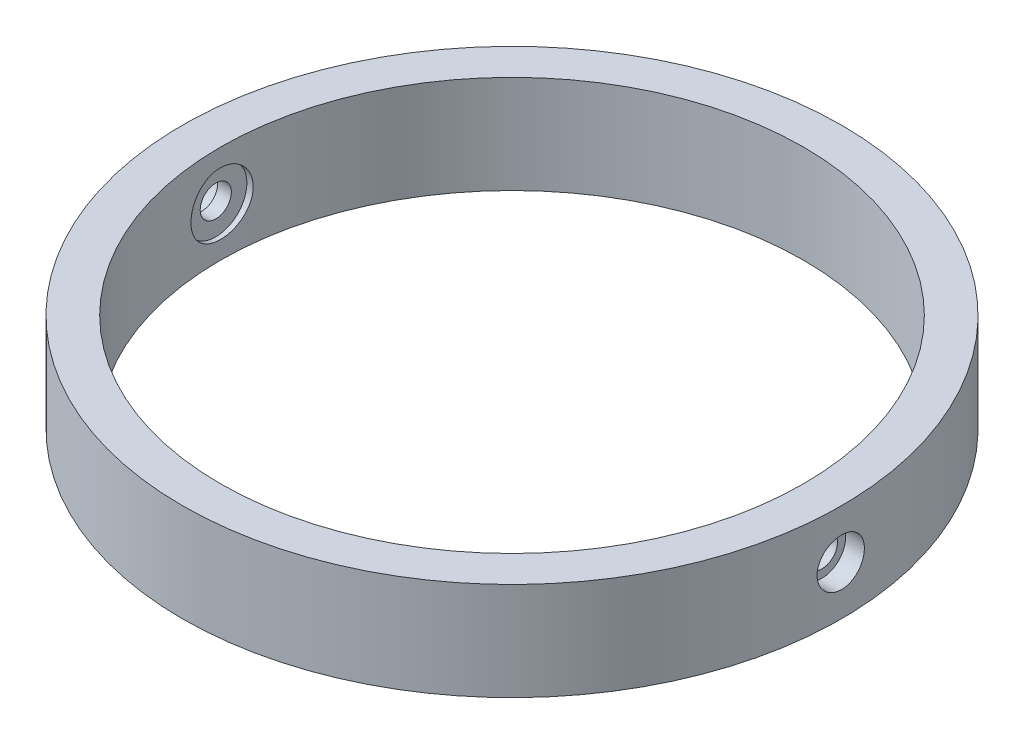
ISO-10303-21;
HEADER;
FILE_DESCRIPTION(('STEP AP214'),'2;1');
FILE_NAME('part.step','',(''),(''),'','','');
FILE_SCHEMA(('AUTOMOTIVE_DESIGN { 1 0 10303 214 1 1 1 1 }'));
ENDSEC;
DATA;
#1=APPLICATION_CONTEXT('core data for automotive mechanical design processes');
#2=APPLICATION_PROTOCOL_DEFINITION('international standard','automotive_design',2000,#1);
#3=PRODUCT_CONTEXT('',#1,'mechanical');
#4=PRODUCT('Part','Part','',(#3));
#5=PRODUCT_RELATED_PRODUCT_CATEGORY('part','',(#4));
#6=PRODUCT_DEFINITION_FORMATION('','',#4);
#7=PRODUCT_DEFINITION_CONTEXT('part definition',#1,'design');
#8=PRODUCT_DEFINITION('design','',#6,#7);
#9=PRODUCT_DEFINITION_SHAPE('','',#8);
#10=(LENGTH_UNIT() NAMED_UNIT(*) SI_UNIT(.MILLI.,.METRE.));
#11=(NAMED_UNIT(*) PLANE_ANGLE_UNIT() SI_UNIT($,.RADIAN.));
#12=(NAMED_UNIT(*) SI_UNIT($,.STERADIAN.) SOLID_ANGLE_UNIT());
#13=UNCERTAINTY_MEASURE_WITH_UNIT(LENGTH_MEASURE(1.E-05),#10,'distance_accuracy_value','');
#14=(GEOMETRIC_REPRESENTATION_CONTEXT(3) GLOBAL_UNCERTAINTY_ASSIGNED_CONTEXT((#13)) GLOBAL_UNIT_ASSIGNED_CONTEXT((#10,
#11,#12)) REPRESENTATION_CONTEXT('',''));
#15=CARTESIAN_POINT('',(0.,0.,0.));
#16=DIRECTION('',(0.,0.,1.));
#17=DIRECTION('',(1.,0.,0.));
#18=AXIS2_PLACEMENT_3D('',#15,#16,#17);
#19=CARTESIAN_POINT('',(0.,20.,0.));
#20=DIRECTION('',(0.,-1.,0.));
#21=DIRECTION('',(0.,0.,-1.));
#22=AXIS2_PLACEMENT_3D('',#19,#20,#21);
#23=CYLINDRICAL_SURFACE('',#22,59.5);
#24=CARTESIAN_POINT('',(-59.1601850909883,10.,-6.35));
#25=CARTESIAN_POINT('',(-59.1601845539401,10.177858235479,-6.35000181991744));
#26=CARTESIAN_POINT('',(-59.1609887968316,10.3556889683963,-6.34252472320293));
#27=CARTESIAN_POINT('',(-59.1641817603019,10.7101381112658,-6.3126723370166));
#28=CARTESIAN_POINT('',(-59.1665708557925,10.8867562243708,-6.29029352239835));
#29=CARTESIAN_POINT('',(-59.1728683947966,11.2375983073693,-6.23077343890782));
#30=CARTESIAN_POINT('',(-59.1767780303469,11.4118202875767,-6.19362058732187));
#31=CARTESIAN_POINT('',(-59.1860058952525,11.7565576284012,-6.10480945007906));
#32=CARTESIAN_POINT('',(-59.191324640246,11.9270716073757,-6.0531458540601));
#33=CARTESIAN_POINT('',(-59.2032119036986,12.262950286994,-5.93575386838234));
#34=CARTESIAN_POINT('',(-59.2097791710607,12.4283199511596,-5.87003955027245));
#35=CARTESIAN_POINT('',(-59.2239825860457,12.7529852841811,-5.72496265164622));
#36=CARTESIAN_POINT('',(-59.2316191270814,12.9122786898548,-5.64559504527158));
#37=CARTESIAN_POINT('',(-59.2477380150364,13.2235235229464,-5.47384429379876));
#38=CARTESIAN_POINT('',(-59.2562198807511,13.3754790551614,-5.38146854141185));
#39=CARTESIAN_POINT('',(-59.2737968063428,13.6711411166963,-5.18428482302075));
#40=CARTESIAN_POINT('',(-59.2828920923482,13.8148445674661,-5.07947226143912));
#41=CARTESIAN_POINT('',(-59.3014675990064,14.0934019921575,-4.85781291590123));
#42=CARTESIAN_POINT('',(-59.3109489915869,14.2282251770395,-4.74092753630107));
#43=CARTESIAN_POINT('',(-59.3300039012184,14.4876054383767,-4.49618763499649));
#44=CARTESIAN_POINT('',(-59.3395774510311,14.6121587011216,-4.36832907407808));
#45=CARTESIAN_POINT('',(-59.358539813522,14.850031428217,-4.10261880438704));
#46=CARTESIAN_POINT('',(-59.3679286845674,14.9633544890972,-3.96477031958345));
#47=CARTESIAN_POINT('',(-59.3862634816156,15.1780535515061,-3.67995616072182));
#48=CARTESIAN_POINT('',(-59.3952092429132,15.279425129669,-3.53298714158714));
#49=CARTESIAN_POINT('',(-59.4124190638075,15.4696466407527,-3.23069944174142));
#50=CARTESIAN_POINT('',(-59.4206817010479,15.5584707075013,-3.07536439918491));
#51=CARTESIAN_POINT('',(-59.4362735489504,15.7227442669823,-2.75766129148768));
#52=CARTESIAN_POINT('',(-59.4436024125747,15.7981887912547,-2.59529064142687));
#53=CARTESIAN_POINT('',(-59.4571116814155,15.9350891830737,-2.26476985161454));
#54=CARTESIAN_POINT('',(-59.4632925349917,15.9965505139275,-2.09662199870431));
#55=CARTESIAN_POINT('',(-59.4743370035061,16.1050907054972,-1.75568637914356));
#56=CARTESIAN_POINT('',(-59.4792001336429,16.1521642736495,-1.58289693043951));
#57=CARTESIAN_POINT('',(-59.4915515842313,16.2708648729264,-1.06087106961213));
#58=CARTESIAN_POINT('',(-59.4968711870658,16.3206502641212,-0.706333907678812));
#59=CARTESIAN_POINT('',(-59.501067463503,16.3600201868868,0.00590767875270165));
#60=CARTESIAN_POINT('',(-59.4999443255711,16.3496064794236,0.36361201029808));
#61=CARTESIAN_POINT('',(-59.4914110327003,16.2691355415424,1.07073540932291));
#62=CARTESIAN_POINT('',(-59.4840264813275,16.1993212024283,1.42018226976127));
#63=CARTESIAN_POINT('',(-59.4638264555333,16.0023884430166,2.10235683282821));
#64=CARTESIAN_POINT('',(-59.4510109022437,15.8752691905435,2.43508429258158));
#65=CARTESIAN_POINT('',(-59.4213461455677,15.5670762748825,3.07515442494716));
#66=CARTESIAN_POINT('',(-59.4044889617189,15.3858956887907,3.3824452356989));
#67=CARTESIAN_POINT('',(-59.3686308976944,14.9747993205711,3.96234876575462));
#68=CARTESIAN_POINT('',(-59.3496299458683,14.7448819093031,4.23496032533747));
#69=CARTESIAN_POINT('',(-59.3115034904501,14.2414737727782,4.73919226036205));
#70=CARTESIAN_POINT('',(-59.2923778380705,13.9677715956847,4.97060157072742));
#71=CARTESIAN_POINT('',(-59.2562517768414,13.3852946667096,5.38422419028105));
#72=CARTESIAN_POINT('',(-59.2392513718216,13.0765198516298,5.56643741081956));
#73=CARTESIAN_POINT('',(-59.2092996302063,12.4324940728439,5.87649777143589));
#74=CARTESIAN_POINT('',(-59.1963493359799,12.0972363210403,6.00433091886726));
#75=CARTESIAN_POINT('',(-59.1759853784343,11.4098458756462,6.20183041327947));
#76=CARTESIAN_POINT('',(-59.1685715224207,11.0577137698177,6.27149878468181));
#77=CARTESIAN_POINT('',(-59.1601537554022,10.3484260518251,6.35041762579798));
#78=CARTESIAN_POINT('',(-59.1591184716032,9.99130369969647,6.35996380964503));
#79=CARTESIAN_POINT('',(-59.1634922382297,9.28054456669105,6.31914479675689));
#80=CARTESIAN_POINT('',(-59.1689011892337,8.92690773212467,6.26878052431881));
#81=CARTESIAN_POINT('',(-59.1855254152414,8.23402601755072,6.10981808484226));
#82=CARTESIAN_POINT('',(-59.196726663607,7.89474850258065,6.00136057387623));
#83=CARTESIAN_POINT('',(-59.223662015714,7.23920024345249,5.72943416451175));
#84=CARTESIAN_POINT('',(-59.2393962371981,6.92293009717211,5.56596383715122));
#85=CARTESIAN_POINT('',(-59.273700456828,6.32102887214396,5.18791506711361));
#86=CARTESIAN_POINT('',(-59.2922811999721,6.03552117882988,4.97314117058382));
#87=CARTESIAN_POINT('',(-59.3301500570556,5.50450262439169,4.49885981918334));
#88=CARTESIAN_POINT('',(-59.3494381909491,5.258992892589,4.23935110167412));
#89=CARTESIAN_POINT('',(-59.3866438023726,4.81391442548028,3.68168627072907));
#90=CARTESIAN_POINT('',(-59.4045553113022,4.61453894918507,3.38337547606046));
#91=CARTESIAN_POINT('',(-59.4369016255883,4.2687220129336,2.75731773926477));
#92=CARTESIAN_POINT('',(-59.4513364842844,4.1222797408473,2.4295712488525));
#93=CARTESIAN_POINT('',(-59.4750779548224,3.88680490032847,1.75467887060643));
#94=CARTESIAN_POINT('',(-59.4843948752273,3.79765686764972,1.40757354124678));
#95=CARTESIAN_POINT('',(-59.4968868067436,3.67894939630887,0.703021006508484));
#96=CARTESIAN_POINT('',(-59.5000620161766,3.64938803353499,0.345574135446411));
#97=CARTESIAN_POINT('',(-59.4999674631901,3.65032024735701,-0.189262029900625));
#98=CARTESIAN_POINT('',(-59.4991327412583,3.65811741057941,-0.366971513063392));
#99=CARTESIAN_POINT('',(-59.4958929726963,3.68857690962291,-0.72107968788013));
#100=CARTESIAN_POINT('',(-59.4934885094451,3.71123372301449,-0.897478841883179));
#101=CARTESIAN_POINT('',(-59.4871732008481,3.77126408994638,-1.2477808194706));
#102=CARTESIAN_POINT('',(-59.4832618049726,3.80864302204989,-1.42168270661284));
#103=CARTESIAN_POINT('',(-59.4740454153425,3.89782448694803,-1.76564515555189));
#104=CARTESIAN_POINT('',(-59.468740930653,3.94962175138334,-1.93570709594701));
#105=CARTESIAN_POINT('',(-59.4568854523657,4.06728137877246,-2.27088171324478));
#106=CARTESIAN_POINT('',(-59.4503342362347,4.13314625295916,-2.43599350047813));
#107=CARTESIAN_POINT('',(-59.4361723505892,4.27843502741959,-2.76001954638217));
#108=CARTESIAN_POINT('',(-59.42856206778,4.35785398097307,-2.91893604019671));
#109=CARTESIAN_POINT('',(-59.4124903081827,4.52973270026393,-3.22958168663427));
#110=CARTESIAN_POINT('',(-59.404028528313,4.62219711414076,-3.38130825160941));
#111=CARTESIAN_POINT('',(-59.3864958726066,4.81945607167647,-3.67640473174115));
#112=CARTESIAN_POINT('',(-59.3774252181481,4.92424614421465,-3.81977764912649));
#113=CARTESIAN_POINT('',(-59.3588776713565,5.14601951168007,-4.09794782523319));
#114=CARTESIAN_POINT('',(-59.3493989275901,5.26306281831304,-4.23269712040796));
#115=CARTESIAN_POINT('',(-59.3303501178715,5.50802427185435,-4.49181813871991));
#116=CARTESIAN_POINT('',(-59.320780086449,5.63593844118554,-4.6161936248418));
#117=CARTESIAN_POINT('',(-59.3018096394586,5.90186366037243,-4.85382257044716));
#118=CARTESIAN_POINT('',(-59.2924093304855,6.03988079804124,-4.96706922607605));
#119=CARTESIAN_POINT('',(-59.2740539268677,6.32492376498711,-5.18151642136345));
#120=CARTESIAN_POINT('',(-59.2650986691159,6.47194624912504,-5.28272139342805));
#121=CARTESIAN_POINT('',(-59.2478559184737,6.77450614361435,-5.47272350878305));
#122=CARTESIAN_POINT('',(-59.2395706811895,6.93006957851431,-5.56147942358735));
#123=CARTESIAN_POINT('',(-59.2239407731537,7.24811403010143,-5.72552433774561));
#124=CARTESIAN_POINT('',(-59.2165957580734,7.41059248515166,-5.80081827118474));
#125=CARTESIAN_POINT('',(-59.2030595051544,7.74123747901447,-5.93737781388975));
#126=CARTESIAN_POINT('',(-59.1968673336353,7.90939928334037,-5.99865478468043));
#127=CARTESIAN_POINT('',(-59.1858090929136,8.25027808649207,-6.10679531405855));
#128=CARTESIAN_POINT('',(-59.1809427011009,8.42299396590779,-6.15366237945264));
#129=CARTESIAN_POINT('',(-59.1713627084447,8.82723819851377,-6.24520802399046));
#130=CARTESIAN_POINT('',(-59.1671882517674,9.06002756900922,-6.28446657281822));
#131=CARTESIAN_POINT('',(-59.1615998057283,9.52856073538735,-6.33686129018909));
#132=CARTESIAN_POINT('',(-59.1601858026779,9.76430451661373,-6.34999758826843));
#133=CARTESIAN_POINT('',(-59.1601850909883,10.,-6.35));
#134=B_SPLINE_CURVE_WITH_KNOTS('',3,(#24,#25,#26,#27,#28,#29,#30,#31,#32,#33,#34,#35,#36,#37,
#38,#39,#40,#41,#42,#43,#44,#45,#46,#47,#48,#49,#50,#51,#52,#53,#54,#55,#56,#57,#58,#59,#60,#61,
#62,#63,#64,#65,#66,#67,#68,#69,#70,#71,#72,#73,#74,#75,#76,#77,#78,#79,#80,#81,#82,#83,#84,#85,
#86,#87,#88,#89,#90,#91,#92,#93,#94,#95,#96,#97,#98,#99,#100,#101,#102,#103,#104,#105,#106,#107,
#108,#109,#110,#111,#112,#113,#114,#115,#116,#117,#118,#119,#120,#121,#122,#123,#124,#125,#126,
#127,#128,#129,#130,#131,#132,#133),.UNSPECIFIED.,.T.,.F.,(4,2,2,2,2,2,2,2,2,2,2,2,2,2,2,2,2,2,
2,2,2,2,2,2,2,2,2,2,2,2,2,2,2,2,2,2,2,2,2,2,2,2,2,2,2,2,2,2,2,2,2,2,2,2,4),(0.,0.53336854129089,
1.06686330094786,1.60077714297354,2.13488663163724,2.66846370378489,3.2022376108343,
3.73570938187622,4.2693788958015,4.80481065395246,5.34044035619797,5.87589796214455,
6.41155312839087,6.94829689599418,7.48523956658603,8.02197208919607,8.55890181283528,
9.62749177854543,10.6960504856317,11.7602607015094,12.8244863722245,13.8908309875979,
14.957211253611,16.0289061947642,17.1006030670642,18.1725755332955,19.2445106880349,
20.3111693290676,21.3778115139294,22.4418827287657,23.5059815850665,24.574200931887,
25.6424504340941,26.7150969977386,27.7877271035566,28.858188718444,29.9286157665264,
30.4617442723413,30.9946747588536,31.5278001264931,32.0607309489252,32.5937569853749,
33.1265889021049,33.6596111502751,34.1924406380099,34.7280140012879,35.2633922385997,
35.7990957809679,36.3346015229338,36.8718408569263,37.4088828764964,37.9454880389827,
38.4819625092355,39.188779256956,39.8955924996716),.UNSPECIFIED.);
#135=CARTESIAN_POINT('',(-59.1601850909883,10.,-6.35));
#136=VERTEX_POINT('',#135);
#137=EDGE_CURVE('E41',#136,#136,#134,.T.);
#138=ORIENTED_EDGE('',*,*,#137,.F.);
#139=EDGE_LOOP('',(#138));
#140=FACE_BOUND('',#139,.T.);
#141=CARTESIAN_POINT('',(0.,0.,0.));
#142=DIRECTION('',(0.,1.,0.));
#143=DIRECTION('',(0.,0.,1.));
#144=AXIS2_PLACEMENT_3D('',#141,#142,#143);
#145=CIRCLE('',#144,59.5);
#146=CARTESIAN_POINT('',(0.,0.,59.5));
#147=VERTEX_POINT('',#146);
#148=EDGE_CURVE('E95',#147,#147,#145,.T.);
#149=ORIENTED_EDGE('',*,*,#148,.F.);
#150=EDGE_LOOP('',(#149));
#151=FACE_BOUND('',#150,.T.);
#152=CARTESIAN_POINT('',(0.,20.,0.));
#153=DIRECTION('',(0.,1.,0.));
#154=DIRECTION('',(0.,0.,1.));
#155=AXIS2_PLACEMENT_3D('',#152,#153,#154);
#156=CIRCLE('',#155,59.5);
#157=CARTESIAN_POINT('',(0.,20.,59.5));
#158=VERTEX_POINT('',#157);
#159=EDGE_CURVE('E100',#158,#158,#156,.T.);
#160=ORIENTED_EDGE('',*,*,#159,.T.);
#161=EDGE_LOOP('',(#160));
#162=FACE_BOUND('',#161,.T.);
#163=CARTESIAN_POINT('',(59.1601850909883,10.,6.35));
#164=CARTESIAN_POINT('',(59.1601845539401,9.82214176452102,6.35000181991744));
#165=CARTESIAN_POINT('',(59.1609887968316,9.64431103160374,6.34252472320293));
#166=CARTESIAN_POINT('',(59.1641817603019,9.28986188873418,6.3126723370166));
#167=CARTESIAN_POINT('',(59.1665708557925,9.1132437756292,6.29029352239835));
#168=CARTESIAN_POINT('',(59.1728683947966,8.76240169263074,6.23077343890782));
#169=CARTESIAN_POINT('',(59.1767780303469,8.58817971242329,6.19362058732187));
#170=CARTESIAN_POINT('',(59.1860058952525,8.24344237159879,6.10480945007906));
#171=CARTESIAN_POINT('',(59.191324640246,8.07292839262427,6.0531458540601));
#172=CARTESIAN_POINT('',(59.2032119036986,7.73704971300599,5.93575386838234));
#173=CARTESIAN_POINT('',(59.2097791710607,7.57168004884036,5.87003955027245));
#174=CARTESIAN_POINT('',(59.2239825860457,7.24701471581892,5.72496265164622));
#175=CARTESIAN_POINT('',(59.2316191270814,7.08772131014517,5.64559504527158));
#176=CARTESIAN_POINT('',(59.2477380150364,6.77647647705357,5.47384429379876));
#177=CARTESIAN_POINT('',(59.2562198807511,6.62452094483859,5.38146854141185));
#178=CARTESIAN_POINT('',(59.2737968063428,6.3288588833037,5.18428482302075));
#179=CARTESIAN_POINT('',(59.2828920923482,6.18515543253395,5.07947226143912));
#180=CARTESIAN_POINT('',(59.3014675990064,5.90659800784247,4.85781291590123));
#181=CARTESIAN_POINT('',(59.3109489915869,5.77177482296051,4.74092753630107));
#182=CARTESIAN_POINT('',(59.3300039012184,5.51239456162332,4.49618763499649));
#183=CARTESIAN_POINT('',(59.3395774510311,5.38784129887844,4.36832907407808));
#184=CARTESIAN_POINT('',(59.358539813522,5.14996857178298,4.10261880438704));
#185=CARTESIAN_POINT('',(59.3679286845674,5.0366455109028,3.96477031958346));
#186=CARTESIAN_POINT('',(59.3862634816156,4.82194644849391,3.67995616072182));
#187=CARTESIAN_POINT('',(59.3952092429132,4.72057487033101,3.53298714158714));
#188=CARTESIAN_POINT('',(59.4124190638075,4.53035335924735,3.23069944174142));
#189=CARTESIAN_POINT('',(59.4206817010479,4.44152929249866,3.07536439918491));
#190=CARTESIAN_POINT('',(59.4362735489504,4.27725573301775,2.75766129148768));
#191=CARTESIAN_POINT('',(59.4436024125747,4.20181120874527,2.59529064142687));
#192=CARTESIAN_POINT('',(59.4571116814155,4.06491081692635,2.26476985161454));
#193=CARTESIAN_POINT('',(59.4632925349917,4.00344948607253,2.09662199870431));
#194=CARTESIAN_POINT('',(59.4743370035061,3.89490929450283,1.75568637914356));
#195=CARTESIAN_POINT('',(59.4792001336429,3.84783572635055,1.58289693043951));
#196=CARTESIAN_POINT('',(59.4915515842313,3.72913512707361,1.06087106961213));
#197=CARTESIAN_POINT('',(59.4968711870658,3.67934973587883,0.706333907678813));
#198=CARTESIAN_POINT('',(59.501067463503,3.63997981311317,-0.00590767875270078));
#199=CARTESIAN_POINT('',(59.4999443255711,3.65039352057639,-0.363612010298079));
#200=CARTESIAN_POINT('',(59.4914110327003,3.73086445845762,-1.07073540932291));
#201=CARTESIAN_POINT('',(59.4840264813275,3.80067879757166,-1.42018226976127));
#202=CARTESIAN_POINT('',(59.4638264555333,3.9976115569834,-2.10235683282821));
#203=CARTESIAN_POINT('',(59.4510109022437,4.12473080945653,-2.43508429258158));
#204=CARTESIAN_POINT('',(59.4213461455677,4.43292372511748,-3.07515442494716));
#205=CARTESIAN_POINT('',(59.4044889617189,4.61410431120932,-3.3824452356989));
#206=CARTESIAN_POINT('',(59.3686308976944,5.02520067942889,-3.96234876575462));
#207=CARTESIAN_POINT('',(59.3496299458683,5.25511809069691,-4.23496032533747));
#208=CARTESIAN_POINT('',(59.3115034904501,5.75852622722175,-4.73919226036205));
#209=CARTESIAN_POINT('',(59.2923778380705,6.0322284043153,-4.97060157072741));
#210=CARTESIAN_POINT('',(59.2562517768414,6.61470533329035,-5.38422419028105));
#211=CARTESIAN_POINT('',(59.2392513718216,6.92348014837019,-5.56643741081956));
#212=CARTESIAN_POINT('',(59.2092996302063,7.56750592715615,-5.87649777143589));
#213=CARTESIAN_POINT('',(59.1963493359799,7.90276367895969,-6.00433091886726));
#214=CARTESIAN_POINT('',(59.1759853784343,8.59015412435375,-6.20183041327947));
#215=CARTESIAN_POINT('',(59.1685715224207,8.9422862301823,-6.27149878468181));
#216=CARTESIAN_POINT('',(59.1601537554022,9.65157394817488,-6.35041762579798));
#217=CARTESIAN_POINT('',(59.1591184716032,10.0086963003035,-6.35996380964503));
#218=CARTESIAN_POINT('',(59.1634922382297,10.719455433309,-6.31914479675689));
#219=CARTESIAN_POINT('',(59.1689011892337,11.0730922678753,-6.26878052431881));
#220=CARTESIAN_POINT('',(59.1855254152414,11.7659739824493,-6.10981808484226));
#221=CARTESIAN_POINT('',(59.196726663607,12.1052514974194,-6.00136057387623));
#222=CARTESIAN_POINT('',(59.223662015714,12.7607997565475,-5.72943416451175));
#223=CARTESIAN_POINT('',(59.2393962371981,13.0770699028279,-5.56596383715122));
#224=CARTESIAN_POINT('',(59.273700456828,13.678971127856,-5.18791506711361));
#225=CARTESIAN_POINT('',(59.2922811999721,13.9644788211701,-4.97314117058382));
#226=CARTESIAN_POINT('',(59.3301500570556,14.4954973756083,-4.49885981918334));
#227=CARTESIAN_POINT('',(59.3494381909491,14.741007107411,-4.23935110167412));
#228=CARTESIAN_POINT('',(59.3866438023726,15.1860855745197,-3.68168627072906));
#229=CARTESIAN_POINT('',(59.4045553113022,15.3854610508149,-3.38337547606045));
#230=CARTESIAN_POINT('',(59.4369016255883,15.7312779870664,-2.75731773926477));
#231=CARTESIAN_POINT('',(59.4513364842844,15.8777202591527,-2.4295712488525));
#232=CARTESIAN_POINT('',(59.4750779548224,16.1131950996715,-1.75467887060642));
#233=CARTESIAN_POINT('',(59.4843948752273,16.2023431323503,-1.40757354124677));
#234=CARTESIAN_POINT('',(59.4968868067436,16.3210506036911,-0.70302100650848));
#235=CARTESIAN_POINT('',(59.5000620161766,16.350611966465,-0.345574135446409));
#236=CARTESIAN_POINT('',(59.4999674631901,16.349679752643,0.189262029900627));
#237=CARTESIAN_POINT('',(59.4991327412583,16.3418825894206,0.366971513063394));
#238=CARTESIAN_POINT('',(59.4958929726963,16.3114230903771,0.721079687880132));
#239=CARTESIAN_POINT('',(59.4934885094451,16.2887662769855,0.897478841883181));
#240=CARTESIAN_POINT('',(59.4871732008481,16.2287359100536,1.2477808194706));
#241=CARTESIAN_POINT('',(59.4832618049726,16.1913569779501,1.42168270661284));
#242=CARTESIAN_POINT('',(59.4740454153425,16.102175513052,1.7656451555519));
#243=CARTESIAN_POINT('',(59.468740930653,16.0503782486167,1.93570709594702));
#244=CARTESIAN_POINT('',(59.4568854523657,15.9327186212275,2.27088171324478));
#245=CARTESIAN_POINT('',(59.4503342362347,15.8668537470408,2.43599350047813));
#246=CARTESIAN_POINT('',(59.4361723505892,15.7215649725804,2.76001954638217));
#247=CARTESIAN_POINT('',(59.42856206778,15.6421460190269,2.91893604019671));
#248=CARTESIAN_POINT('',(59.4124903081827,15.4702672997361,3.22958168663427));
#249=CARTESIAN_POINT('',(59.404028528313,15.3778028858592,3.38130825160941));
#250=CARTESIAN_POINT('',(59.3864958726066,15.1805439283235,3.67640473174115));
#251=CARTESIAN_POINT('',(59.3774252181481,15.0757538557854,3.81977764912649));
#252=CARTESIAN_POINT('',(59.3588776713565,14.8539804883199,4.09794782523319));
#253=CARTESIAN_POINT('',(59.3493989275901,14.736937181687,4.23269712040797));
#254=CARTESIAN_POINT('',(59.3303501178715,14.4919757281456,4.49181813871991));
#255=CARTESIAN_POINT('',(59.320780086449,14.3640615588145,4.6161936248418));
#256=CARTESIAN_POINT('',(59.3018096394586,14.0981363396276,4.85382257044716));
#257=CARTESIAN_POINT('',(59.2924093304855,13.9601192019588,4.96706922607605));
#258=CARTESIAN_POINT('',(59.2740539268677,13.6750762350129,5.18151642136345));
#259=CARTESIAN_POINT('',(59.2650986691159,13.528053750875,5.28272139342805));
#260=CARTESIAN_POINT('',(59.2478559184737,13.2254938563856,5.47272350878305));
#261=CARTESIAN_POINT('',(59.2395706811895,13.0699304214857,5.56147942358735));
#262=CARTESIAN_POINT('',(59.2239407731537,12.7518859698986,5.72552433774561));
#263=CARTESIAN_POINT('',(59.2165957580734,12.5894075148483,5.80081827118474));
#264=CARTESIAN_POINT('',(59.2030595051544,12.2587625209855,5.93737781388975));
#265=CARTESIAN_POINT('',(59.1968673336353,12.0906007166596,5.99865478468043));
#266=CARTESIAN_POINT('',(59.1858090929136,11.7497219135079,6.10679531405855));
#267=CARTESIAN_POINT('',(59.1809427011009,11.5770060340922,6.15366237945264));
#268=CARTESIAN_POINT('',(59.1713627084447,11.1727618014862,6.24520802399047));
#269=CARTESIAN_POINT('',(59.1671882517674,10.9399724309908,6.28446657281822));
#270=CARTESIAN_POINT('',(59.1615998057283,10.4714392646126,6.33686129018909));
#271=CARTESIAN_POINT('',(59.1601858026779,10.2356954833863,6.34999758826843));
#272=CARTESIAN_POINT('',(59.1601850909883,10.,6.35));
#273=B_SPLINE_CURVE_WITH_KNOTS('',3,(#163,#164,#165,#166,#167,#168,#169,#170,#171,#172,#173,
#174,#175,#176,#177,#178,#179,#180,#181,#182,#183,#184,#185,#186,#187,#188,#189,#190,#191,#192,
#193,#194,#195,#196,#197,#198,#199,#200,#201,#202,#203,#204,#205,#206,#207,#208,#209,#210,#211,
#212,#213,#214,#215,#216,#217,#218,#219,#220,#221,#222,#223,#224,#225,#226,#227,#228,#229,#230,
#231,#232,#233,#234,#235,#236,#237,#238,#239,#240,#241,#242,#243,#244,#245,#246,#247,#248,#249,
#250,#251,#252,#253,#254,#255,#256,#257,#258,#259,#260,#261,#262,#263,#264,#265,#266,#267,#268,
#269,#270,#271,#272),.UNSPECIFIED.,.T.,.F.,(4,2,2,2,2,2,2,2,2,2,2,2,2,2,2,2,2,2,2,2,2,2,2,2,2,2,
2,2,2,2,2,2,2,2,2,2,2,2,2,2,2,2,2,2,2,2,2,2,2,2,2,2,2,2,4),(0.,0.53336854129089,
1.06686330094786,1.60077714297354,2.13488663163724,2.66846370378489,3.2022376108343,
3.73570938187621,4.2693788958015,4.80481065395246,5.34044035619796,5.87589796214454,
6.41155312839086,6.94829689599418,7.48523956658602,8.02197208919607,8.55890181283527,
9.62749177854543,10.6960504856317,11.7602607015094,12.8244863722245,13.8908309875979,
14.957211253611,16.0289061947642,17.1006030670642,18.1725755332955,19.2445106880349,
20.3111693290675,21.3778115139294,22.4418827287657,23.5059815850665,24.574200931887,
25.6424504340941,26.7150969977386,27.7877271035566,28.858188718444,29.9286157665264,
30.4617442723413,30.9946747588535,31.5278001264931,32.0607309489252,32.5937569853749,
33.1265889021049,33.6596111502751,34.1924406380099,34.7280140012879,35.2633922385997,
35.7990957809679,36.3346015229337,36.8718408569263,37.4088828764964,37.9454880389827,
38.4819625092355,39.1887792569559,39.8955924996716),.UNSPECIFIED.);
#274=CARTESIAN_POINT('',(59.1601850909883,10.,6.35));
#275=VERTEX_POINT('',#274);
#276=EDGE_CURVE('E64',#275,#275,#273,.T.);
#277=ORIENTED_EDGE('',*,*,#276,.T.);
#278=EDGE_LOOP('',(#277));
#279=FACE_BOUND('',#278,.T.);
#280=ADVANCED_FACE('F36',(#140,#151,#162,#279),#23,.F.);
#281=CARTESIAN_POINT('',(0.,20.,0.));
#282=DIRECTION('',(0.,-1.,0.));
#283=DIRECTION('',(0.,0.,-1.));
#284=AXIS2_PLACEMENT_3D('',#281,#282,#283);
#285=CYLINDRICAL_SURFACE('',#284,67.25);
#286=CARTESIAN_POINT('',(0.,0.,0.));
#287=DIRECTION('',(0.,1.,0.));
#288=DIRECTION('',(0.,0.,1.));
#289=AXIS2_PLACEMENT_3D('',#286,#287,#288);
#290=CIRCLE('',#289,67.25);
#291=CARTESIAN_POINT('',(0.,0.,67.25));
#292=VERTEX_POINT('',#291);
#293=EDGE_CURVE('E97',#292,#292,#290,.T.);
#294=ORIENTED_EDGE('',*,*,#293,.T.);
#295=EDGE_LOOP('',(#294));
#296=FACE_BOUND('',#295,.T.);
#297=CARTESIAN_POINT('',(0.,20.,0.));
#298=DIRECTION('',(0.,1.,0.));
#299=DIRECTION('',(0.,0.,1.));
#300=AXIS2_PLACEMENT_3D('',#297,#298,#299);
#301=CIRCLE('',#300,67.25);
#302=CARTESIAN_POINT('',(0.,20.,67.25));
#303=VERTEX_POINT('',#302);
#304=EDGE_CURVE('E55',#303,#303,#301,.T.);
#305=ORIENTED_EDGE('',*,*,#304,.F.);
#306=EDGE_LOOP('',(#305));
#307=FACE_BOUND('',#306,.T.);
#308=CARTESIAN_POINT('',(67.0766145836237,10.,-4.826));
#309=CARTESIAN_POINT('',(67.0766143542571,9.86459977923075,-4.82600115153548));
#310=CARTESIAN_POINT('',(67.0770254128121,9.72921775191525,-4.82029948930942));
#311=CARTESIAN_POINT('',(67.0786575838854,9.45937340859085,-4.79753393063069));
#312=CARTESIAN_POINT('',(67.0798788998402,9.3249113321279,-4.78046718067053));
#313=CARTESIAN_POINT('',(67.0830985840977,9.05779729782101,-4.73507130334742));
#314=CARTESIAN_POINT('',(67.0850976071727,8.92514696300002,-4.70673268544896));
#315=CARTESIAN_POINT('',(67.0898164012862,8.66266457469935,-4.6389856296035));
#316=CARTESIAN_POINT('',(67.0925364358857,8.53283357062198,-4.59957314336021));
#317=CARTESIAN_POINT('',(67.0986165747207,8.27708017261406,-4.51000718117531));
#318=CARTESIAN_POINT('',(67.1019760918955,8.15115431601334,-4.45986355147903));
#319=CARTESIAN_POINT('',(67.1092426619567,7.90393207327885,-4.3491523190081));
#320=CARTESIAN_POINT('',(67.1131499163057,7.78263741152055,-4.28858087891422));
#321=CARTESIAN_POINT('',(67.121397641247,7.54565391044139,-4.15749762142593));
#322=CARTESIAN_POINT('',(67.1257378530829,7.42996178346984,-4.08699173106768));
#323=CARTESIAN_POINT('',(67.1347322307028,7.20487921412032,-3.9364846278044));
#324=CARTESIAN_POINT('',(67.1393865119929,7.09549111791649,-3.85647991318565));
#325=CARTESIAN_POINT('',(67.1488823440304,6.88369030193709,-3.68744795352717));
#326=CARTESIAN_POINT('',(67.1537241385102,6.78128717335932,-3.5984087040665));
#327=CARTESIAN_POINT('',(67.1634537339039,6.58430436681102,-3.41199273883764));
#328=CARTESIAN_POINT('',(67.1683415511542,6.4897275932328,-3.3146129549027));
#329=CARTESIAN_POINT('',(67.1780213941281,6.30913773525658,-3.11226524876525));
#330=CARTESIAN_POINT('',(67.182813450566,6.22312186860694,-3.00729981113113));
#331=CARTESIAN_POINT('',(67.1921695430177,6.06019759324596,-2.79045367404694));
#332=CARTESIAN_POINT('',(67.1967334942174,5.98329255776599,-2.67857043651073));
#333=CARTESIAN_POINT('',(67.2055052761966,5.83912280457494,-2.44863284611958));
#334=CARTESIAN_POINT('',(67.2097128557315,5.77186486534683,-2.33057423288671));
#335=CARTESIAN_POINT('',(67.2176504697667,5.64751076076892,-2.08915306178009));
#336=CARTESIAN_POINT('',(67.2213803270883,5.59041836259196,-1.96578855857512));
#337=CARTESIAN_POINT('',(67.2282531670429,5.48685499781875,-1.71470778370485));
#338=CARTESIAN_POINT('',(67.2313963722704,5.44038000113674,-1.58699318444404));
#339=CARTESIAN_POINT('',(67.2370101961798,5.35834459604279,-1.32807713810771));
#340=CARTESIAN_POINT('',(67.2394805666532,5.32278821488805,-1.19687442380595));
#341=CARTESIAN_POINT('',(67.2457586527246,5.23307253747192,-0.799984216713507));
#342=CARTESIAN_POINT('',(67.2484535419749,5.19557234687093,-0.530298972244429));
#343=CARTESIAN_POINT('',(67.2505455182025,5.16638572594374,0.0114041787314693));
#344=CARTESIAN_POINT('',(67.2499426522517,5.17469864168591,0.283422051887249));
#345=CARTESIAN_POINT('',(67.2455169766307,5.23677880138093,0.821720287759098));
#346=CARTESIAN_POINT('',(67.2417000978125,5.29046232314545,1.08801029259829));
#347=CARTESIAN_POINT('',(67.2312812699196,5.44164568800465,1.60777940307261));
#348=CARTESIAN_POINT('',(67.2246793002236,5.53914585552778,1.86125841383676));
#349=CARTESIAN_POINT('',(67.2094235563685,5.7752848053433,2.34849090275402));
#350=CARTESIAN_POINT('',(67.2007678999663,5.91396135607159,2.58222601717939));
#351=CARTESIAN_POINT('',(67.1823782265001,6.22849024698005,3.02313188305647));
#352=CARTESIAN_POINT('',(67.1726441933117,6.40434314307796,3.23030223719668));
#353=CARTESIAN_POINT('',(67.1531667567424,6.78870517666323,3.61268783926359));
#354=CARTESIAN_POINT('',(67.1434233817027,6.99728703499194,3.78783000052342));
#355=CARTESIAN_POINT('',(67.1250476149401,7.44093198180422,4.1006233519959));
#356=CARTESIAN_POINT('',(67.1164152238272,7.67599508482784,4.23827452162323));
#357=CARTESIAN_POINT('',(67.1012366731445,8.16597837300581,4.47217433448467));
#358=CARTESIAN_POINT('',(67.0946906834304,8.42090017277312,4.56841960705073));
#359=CARTESIAN_POINT('',(67.0844288381244,8.94334197252948,4.71672360840278));
#360=CARTESIAN_POINT('',(67.0807129385569,9.21086177669477,4.76878302377591));
#361=CARTESIAN_POINT('',(67.0765386294891,9.75026733109607,4.82714588551937));
#362=CARTESIAN_POINT('',(67.0760729777165,10.0221420208434,4.83355106032996));
#363=CARTESIAN_POINT('',(67.0784327435742,10.563100834311,4.80068968819308));
#364=CARTESIAN_POINT('',(67.0812581385394,10.8321849772366,4.76142345578064));
#365=CARTESIAN_POINT('',(67.0898750106539,11.3596349342324,4.63841854043575));
#366=CARTESIAN_POINT('',(67.0956633458287,11.6180117894713,4.55472696375741));
#367=CARTESIAN_POINT('',(67.1095512073124,12.1170540950931,4.3452947686887));
#368=CARTESIAN_POINT('',(67.1176507612245,12.3577193339019,4.21955364809501));
#369=CARTESIAN_POINT('',(67.1352659507084,12.8149733987069,3.92933303195188));
#370=CARTESIAN_POINT('',(67.1447840614799,13.0315189612904,3.76478552597229));
#371=CARTESIAN_POINT('',(67.1641552834071,13.4339502324056,3.40172074314994));
#372=CARTESIAN_POINT('',(67.1740083988547,13.6198355479538,3.20320303096508));
#373=CARTESIAN_POINT('',(67.1929607947367,13.9560152078101,2.77739807490467));
#374=CARTESIAN_POINT('',(67.2020586586529,14.1062436143235,2.55005870550241));
#375=CARTESIAN_POINT('',(67.2184548382336,14.3663919107393,2.07331141376479));
#376=CARTESIAN_POINT('',(67.2257531678439,14.476312113022,1.82390366247348));
#377=CARTESIAN_POINT('',(67.2377221904748,14.6526149528286,1.31038965581037));
#378=CARTESIAN_POINT('',(67.2423953775892,14.7190389252046,1.04629761480014));
#379=CARTESIAN_POINT('',(67.2485942756875,14.8065792653445,0.510526746174069));
#380=CARTESIAN_POINT('',(67.2501200293357,14.8276962472567,0.2388480214483));
#381=CARTESIAN_POINT('',(67.2499283552717,14.8249898242707,-0.167860094693987));
#382=CARTESIAN_POINT('',(67.249452086835,14.8183713360808,-0.303215162816434));
#383=CARTESIAN_POINT('',(67.2476946167946,14.7937863506934,-0.572871949689492));
#384=CARTESIAN_POINT('',(67.2464137131451,14.7758240540647,-0.707174039724773));
#385=CARTESIAN_POINT('',(67.2430812251801,14.7286671346313,-0.97382306138555));
#386=CARTESIAN_POINT('',(67.2410293567355,14.6994683706766,-1.10616925347828));
#387=CARTESIAN_POINT('',(67.2362143592538,14.63006438552,-1.36788057542403));
#388=CARTESIAN_POINT('',(67.2334514916022,14.5898632088039,-1.49724678181072));
#389=CARTESIAN_POINT('',(67.2272910101894,14.498721836832,-1.75217253109276));
#390=CARTESIAN_POINT('',(67.2238931808625,14.4477779937494,-1.87773076432866));
#391=CARTESIAN_POINT('',(67.2165607343421,14.3355444372941,-2.12406271796943));
#392=CARTESIAN_POINT('',(67.2126263145078,14.2742585258028,-2.244838176514));
#393=CARTESIAN_POINT('',(67.2043292464678,14.1417408945371,-2.48084248970184));
#394=CARTESIAN_POINT('',(67.1999664520135,14.0705057745394,-2.59606942991247));
#395=CARTESIAN_POINT('',(67.1909384590913,13.9186385368044,-2.82008023335535));
#396=CARTESIAN_POINT('',(67.1862733718073,13.8380098654272,-2.92886643764721));
#397=CARTESIAN_POINT('',(67.1767589106736,13.6676911794219,-3.13953993790638));
#398=CARTESIAN_POINT('',(67.1719091059944,13.5779790546353,-3.24140934044341));
#399=CARTESIAN_POINT('',(67.1621753304497,13.3903310259894,-3.43719520112604));
#400=CARTESIAN_POINT('',(67.1572913727726,13.292398151485,-3.53111456346863));
#401=CARTESIAN_POINT('',(67.1476228215817,13.0889089831548,-3.71043383864625));
#402=CARTESIAN_POINT('',(67.1428382907919,12.983348054501,-3.7958284955249));
#403=CARTESIAN_POINT('',(67.1335091557558,12.7654420432495,-3.95739769841684));
#404=CARTESIAN_POINT('',(67.1289644636362,12.65309947814,-4.0335756347062));
#405=CARTESIAN_POINT('',(67.1202339668636,12.4221722650424,-4.17634036948075));
#406=CARTESIAN_POINT('',(67.116048848829,12.3035763433053,-4.24290897649129));
#407=CARTESIAN_POINT('',(67.1081679289336,12.0612230340844,-4.3657860696299));
#408=CARTESIAN_POINT('',(67.104471948342,11.937467553762,-4.42209830628326));
#409=CARTESIAN_POINT('',(67.0976760238486,11.6857388121878,-4.52404497709594));
#410=CARTESIAN_POINT('',(67.0945755723938,11.5577692524422,-4.56968851116114));
#411=CARTESIAN_POINT('',(67.089056008841,11.2984674891268,-4.65001949260307));
#412=CARTESIAN_POINT('',(67.0866367237162,11.1671361487651,-4.68470972256202));
#413=CARTESIAN_POINT('',(67.081975489736,10.8648501103212,-4.75105065509091));
#414=CARTESIAN_POINT('',(67.0799728237146,10.6930962910942,-4.77913121051552));
#415=CARTESIAN_POINT('',(67.0772925190907,10.3475516577823,-4.81660512634263));
#416=CARTESIAN_POINT('',(67.0766148779729,10.1737608475649,-4.82599852221969));
#417=CARTESIAN_POINT('',(67.0766145836237,10.,-4.826));
#418=B_SPLINE_CURVE_WITH_KNOTS('',3,(#308,#309,#310,#311,#312,#313,#314,#315,#316,#317,#318,
#319,#320,#321,#322,#323,#324,#325,#326,#327,#328,#329,#330,#331,#332,#333,#334,#335,#336,#337,
#338,#339,#340,#341,#342,#343,#344,#345,#346,#347,#348,#349,#350,#351,#352,#353,#354,#355,#356,
#357,#358,#359,#360,#361,#362,#363,#364,#365,#366,#367,#368,#369,#370,#371,#372,#373,#374,#375,
#376,#377,#378,#379,#380,#381,#382,#383,#384,#385,#386,#387,#388,#389,#390,#391,#392,#393,#394,
#395,#396,#397,#398,#399,#400,#401,#402,#403,#404,#405,#406,#407,#408,#409,#410,#411,#412,#413,
#414,#415,#416,#417),.UNSPECIFIED.,.T.,.F.,(4,2,2,2,2,2,2,2,2,2,2,2,2,2,2,2,2,2,2,2,2,2,2,2,2,2,
2,2,2,2,2,2,2,2,2,2,2,2,2,2,2,2,2,2,2,2,2,2,2,2,2,2,2,2,4),(0.,0.406048795716768,
0.812199579238816,1.21869305446012,1.62533532609643,2.03160607502822,2.43802664793588,
2.8442057631737,3.25053508281462,3.65741155428429,4.0644383483851,4.47133242588852,
4.87837668579088,5.28570556671606,5.69318508389302,6.10050967464985,6.50798432435722,
7.3206406598886,8.1332853956758,8.94443382747393,9.75558826529936,10.5674890332234,
11.3794019427922,12.1931450848909,13.0068886737935,13.8206984933764,14.634495667248,
15.446478940142,16.2584566210109,17.0695750390853,17.8807031448014,18.6932635039824,
19.5058342772371,20.319896172625,21.1339517590658,21.9472326142542,22.7605024451355,
23.1666602541817,23.5726677526623,23.9788250269207,24.384833197885,24.790979457406,
25.196976736137,25.6031131088264,26.0091009423457,26.4161019041152,26.822953538528,
27.2300544901512,27.6370052356343,28.0447165529528,28.4522784787051,28.8594914941276,
29.2666009775883,29.7876896171339,30.3087772674759),.UNSPECIFIED.);
#419=CARTESIAN_POINT('',(67.0766145836237,10.,-4.826));
#420=VERTEX_POINT('',#419);
#421=EDGE_CURVE('E50',#420,#420,#418,.T.);
#422=ORIENTED_EDGE('',*,*,#421,.T.);
#423=EDGE_LOOP('',(#422));
#424=FACE_BOUND('',#423,.T.);
#425=CARTESIAN_POINT('',(-67.0766145836237,10.,4.826));
#426=CARTESIAN_POINT('',(-67.0766143542571,10.1354002207692,4.82600115153548));
#427=CARTESIAN_POINT('',(-67.0770254128121,10.2707822480848,4.82029948930942));
#428=CARTESIAN_POINT('',(-67.0786575838854,10.5406265914092,4.79753393063069));
#429=CARTESIAN_POINT('',(-67.0798788998402,10.6750886678721,4.78046718067053));
#430=CARTESIAN_POINT('',(-67.0830985840977,10.942202702179,4.73507130334742));
#431=CARTESIAN_POINT('',(-67.0850976071727,11.074853037,4.70673268544896));
#432=CARTESIAN_POINT('',(-67.0898164012862,11.3373354253006,4.6389856296035));
#433=CARTESIAN_POINT('',(-67.0925364358857,11.467166429378,4.59957314336021));
#434=CARTESIAN_POINT('',(-67.0986165747207,11.7229198273859,4.51000718117531));
#435=CARTESIAN_POINT('',(-67.1019760918955,11.8488456839867,4.45986355147903));
#436=CARTESIAN_POINT('',(-67.1092426619567,12.0960679267211,4.3491523190081));
#437=CARTESIAN_POINT('',(-67.1131499163057,12.2173625884794,4.28858087891422));
#438=CARTESIAN_POINT('',(-67.121397641247,12.4543460895586,4.15749762142593));
#439=CARTESIAN_POINT('',(-67.1257378530829,12.5700382165302,4.08699173106768));
#440=CARTESIAN_POINT('',(-67.1347322307028,12.7951207858797,3.9364846278044));
#441=CARTESIAN_POINT('',(-67.1393865119929,12.9045088820835,3.85647991318566));
#442=CARTESIAN_POINT('',(-67.1488823440304,13.1163096980629,3.68744795352717));
#443=CARTESIAN_POINT('',(-67.1537241385102,13.2187128266407,3.5984087040665));
#444=CARTESIAN_POINT('',(-67.1634537339039,13.415695633189,3.41199273883764));
#445=CARTESIAN_POINT('',(-67.1683415511542,13.5102724067672,3.3146129549027));
#446=CARTESIAN_POINT('',(-67.1780213941281,13.6908622647434,3.11226524876525));
#447=CARTESIAN_POINT('',(-67.182813450566,13.7768781313931,3.00729981113112));
#448=CARTESIAN_POINT('',(-67.1921695430177,13.939802406754,2.79045367404693));
#449=CARTESIAN_POINT('',(-67.1967334942174,14.016707442234,2.67857043651073));
#450=CARTESIAN_POINT('',(-67.2055052761966,14.1608771954251,2.44863284611958));
#451=CARTESIAN_POINT('',(-67.2097128557315,14.2281351346532,2.33057423288671));
#452=CARTESIAN_POINT('',(-67.2176504697667,14.3524892392311,2.08915306178009));
#453=CARTESIAN_POINT('',(-67.2213803270883,14.409581637408,1.96578855857512));
#454=CARTESIAN_POINT('',(-67.2282531670429,14.5131450021813,1.71470778370485));
#455=CARTESIAN_POINT('',(-67.2313963722704,14.5596199988633,1.58699318444404));
#456=CARTESIAN_POINT('',(-67.2370101961798,14.6416554039572,1.32807713810771));
#457=CARTESIAN_POINT('',(-67.2394805666532,14.6772117851119,1.19687442380595));
#458=CARTESIAN_POINT('',(-67.2457586527246,14.7669274625281,0.799984216713508));
#459=CARTESIAN_POINT('',(-67.2484535419749,14.8044276531291,0.53029897224443));
#460=CARTESIAN_POINT('',(-67.2505455182025,14.8336142740563,-0.0114041787314683));
#461=CARTESIAN_POINT('',(-67.2499426522517,14.8253013583141,-0.283422051887248));
#462=CARTESIAN_POINT('',(-67.2455169766307,14.7632211986191,-0.821720287759097));
#463=CARTESIAN_POINT('',(-67.2417000978125,14.7095376768545,-1.08801029259829));
#464=CARTESIAN_POINT('',(-67.2312812699196,14.5583543119954,-1.60777940307261));
#465=CARTESIAN_POINT('',(-67.2246793002236,14.4608541444722,-1.86125841383675));
#466=CARTESIAN_POINT('',(-67.2094235563685,14.2247151946567,-2.34849090275402));
#467=CARTESIAN_POINT('',(-67.2007678999663,14.0860386439284,-2.58222601717939));
#468=CARTESIAN_POINT('',(-67.1823782265001,13.77150975302,-3.02313188305647));
#469=CARTESIAN_POINT('',(-67.1726441933117,13.595656856922,-3.23030223719668));
#470=CARTESIAN_POINT('',(-67.1531667567424,13.2112948233368,-3.61268783926359));
#471=CARTESIAN_POINT('',(-67.1434233817027,13.0027129650081,-3.78783000052342));
#472=CARTESIAN_POINT('',(-67.1250476149401,12.5590680181958,-4.1006233519959));
#473=CARTESIAN_POINT('',(-67.1164152238272,12.3240049151722,-4.23827452162323));
#474=CARTESIAN_POINT('',(-67.1012366731445,11.8340216269942,-4.47217433448466));
#475=CARTESIAN_POINT('',(-67.0946906834304,11.5790998272269,-4.56841960705073));
#476=CARTESIAN_POINT('',(-67.0844288381244,11.0566580274705,-4.71672360840278));
#477=CARTESIAN_POINT('',(-67.0807129385569,10.7891382233052,-4.76878302377591));
#478=CARTESIAN_POINT('',(-67.0765386294891,10.2497326689039,-4.82714588551937));
#479=CARTESIAN_POINT('',(-67.0760729777165,9.97785797915659,-4.83355106032996));
#480=CARTESIAN_POINT('',(-67.0784327435742,9.43689916568902,-4.80068968819308));
#481=CARTESIAN_POINT('',(-67.0812581385394,9.16781502276341,-4.76142345578064));
#482=CARTESIAN_POINT('',(-67.0898750106539,8.64036506576759,-4.63841854043575));
#483=CARTESIAN_POINT('',(-67.0956633458287,8.38198821052866,-4.55472696375741));
#484=CARTESIAN_POINT('',(-67.1095512073124,7.88294590490689,-4.3452947686887));
#485=CARTESIAN_POINT('',(-67.1176507612245,7.64228066609815,-4.21955364809501));
#486=CARTESIAN_POINT('',(-67.1352659507084,7.18502660129307,-3.92933303195188));
#487=CARTESIAN_POINT('',(-67.1447840614799,6.96848103870963,-3.76478552597229));
#488=CARTESIAN_POINT('',(-67.1641552834071,6.56604976759438,-3.40172074314994));
#489=CARTESIAN_POINT('',(-67.1740083988547,6.38016445204616,-3.20320303096508));
#490=CARTESIAN_POINT('',(-67.1929607947367,6.04398479218992,-2.77739807490467));
#491=CARTESIAN_POINT('',(-67.2020586586529,5.89375638567649,-2.55005870550242));
#492=CARTESIAN_POINT('',(-67.2184548382336,5.63360808926072,-2.07331141376479));
#493=CARTESIAN_POINT('',(-67.2257531678439,5.52368788697803,-1.82390366247348));
#494=CARTESIAN_POINT('',(-67.2377221904748,5.34738504717139,-1.31038965581037));
#495=CARTESIAN_POINT('',(-67.2423953775892,5.28096107479544,-1.04629761480015));
#496=CARTESIAN_POINT('',(-67.2485942756875,5.19342073465552,-0.510526746174073));
#497=CARTESIAN_POINT('',(-67.2501200293357,5.17230375274328,-0.238848021448303));
#498=CARTESIAN_POINT('',(-67.2499283552717,5.1750101757293,0.167860094693983));
#499=CARTESIAN_POINT('',(-67.249452086835,5.18162866391924,0.303215162816429));
#500=CARTESIAN_POINT('',(-67.2476946167946,5.20621364930664,0.572871949689487));
#501=CARTESIAN_POINT('',(-67.2464137131451,5.22417594593532,0.707174039724769));
#502=CARTESIAN_POINT('',(-67.2430812251801,5.27133286536875,0.973823061385547));
#503=CARTESIAN_POINT('',(-67.2410293567355,5.30053162932345,1.10616925347828));
#504=CARTESIAN_POINT('',(-67.2362143592538,5.36993561447997,1.36788057542403));
#505=CARTESIAN_POINT('',(-67.2334514916022,5.41013679119611,1.49724678181072));
#506=CARTESIAN_POINT('',(-67.2272910101894,5.501278163168,1.75217253109276));
#507=CARTESIAN_POINT('',(-67.2238931808625,5.55222200625056,1.87773076432865));
#508=CARTESIAN_POINT('',(-67.2165607343421,5.66445556270587,2.12406271796943));
#509=CARTESIAN_POINT('',(-67.2126263145078,5.72574147419716,2.24483817651399));
#510=CARTESIAN_POINT('',(-67.2043292464678,5.85825910546294,2.48084248970184));
#511=CARTESIAN_POINT('',(-67.1999664520135,5.92949422546062,2.59606942991247));
#512=CARTESIAN_POINT('',(-67.1909384590913,6.08136146319557,2.82008023335535));
#513=CARTESIAN_POINT('',(-67.1862733718073,6.16199013457277,2.92886643764721));
#514=CARTESIAN_POINT('',(-67.1767589106736,6.33230882057806,3.13953993790637));
#515=CARTESIAN_POINT('',(-67.1719091059944,6.42202094536468,3.24140934044341));
#516=CARTESIAN_POINT('',(-67.1621753304497,6.60966897401056,3.43719520112604));
#517=CARTESIAN_POINT('',(-67.1572913727726,6.70760184851503,3.53111456346862));
#518=CARTESIAN_POINT('',(-67.1476228215817,6.91109101684519,3.71043383864625));
#519=CARTESIAN_POINT('',(-67.1428382907919,7.01665194549898,3.7958284955249));
#520=CARTESIAN_POINT('',(-67.1335091557558,7.23455795675048,3.95739769841683));
#521=CARTESIAN_POINT('',(-67.1289644636362,7.34690052185996,4.0335756347062));
#522=CARTESIAN_POINT('',(-67.1202339668636,7.57782773495762,4.17634036948075));
#523=CARTESIAN_POINT('',(-67.116048848829,7.69642365669466,4.24290897649129));
#524=CARTESIAN_POINT('',(-67.1081679289336,7.93877696591556,4.3657860696299));
#525=CARTESIAN_POINT('',(-67.104471948342,8.06253244623796,4.42209830628326));
#526=CARTESIAN_POINT('',(-67.0976760238486,8.31426118781217,4.52404497709594));
#527=CARTESIAN_POINT('',(-67.0945755723938,8.44223074755778,4.56968851116114));
#528=CARTESIAN_POINT('',(-67.089056008841,8.70153251087321,4.65001949260307));
#529=CARTESIAN_POINT('',(-67.0866367237162,8.83286385123488,4.68470972256202));
#530=CARTESIAN_POINT('',(-67.081975489736,9.13514988967882,4.75105065509091));
#531=CARTESIAN_POINT('',(-67.0799728237146,9.30690370890578,4.77913121051552));
#532=CARTESIAN_POINT('',(-67.0772925190907,9.6524483422177,4.81660512634264));
#533=CARTESIAN_POINT('',(-67.0766148779729,9.82623915243514,4.82599852221969));
#534=CARTESIAN_POINT('',(-67.0766145836237,10.,4.826));
#535=B_SPLINE_CURVE_WITH_KNOTS('',3,(#425,#426,#427,#428,#429,#430,#431,#432,#433,#434,#435,
#436,#437,#438,#439,#440,#441,#442,#443,#444,#445,#446,#447,#448,#449,#450,#451,#452,#453,#454,
#455,#456,#457,#458,#459,#460,#461,#462,#463,#464,#465,#466,#467,#468,#469,#470,#471,#472,#473,
#474,#475,#476,#477,#478,#479,#480,#481,#482,#483,#484,#485,#486,#487,#488,#489,#490,#491,#492,
#493,#494,#495,#496,#497,#498,#499,#500,#501,#502,#503,#504,#505,#506,#507,#508,#509,#510,#511,
#512,#513,#514,#515,#516,#517,#518,#519,#520,#521,#522,#523,#524,#525,#526,#527,#528,#529,#530,
#531,#532,#533,#534),.UNSPECIFIED.,.T.,.F.,(4,2,2,2,2,2,2,2,2,2,2,2,2,2,2,2,2,2,2,2,2,2,2,2,2,2,
2,2,2,2,2,2,2,2,2,2,2,2,2,2,2,2,2,2,2,2,2,2,2,2,2,2,2,2,4),(0.,0.406048795716768,
0.812199579238816,1.21869305446012,1.62533532609643,2.03160607502822,2.43802664793588,
2.84420576317369,3.25053508281462,3.65741155428429,4.0644383483851,4.47133242588852,
4.87837668579088,5.28570556671606,5.69318508389302,6.10050967464985,6.50798432435722,
7.3206406598886,8.1332853956758,8.94443382747393,9.75558826529936,10.5674890332234,
11.3794019427922,12.1931450848909,13.0068886737935,13.8206984933764,14.634495667248,
15.446478940142,16.2584566210109,17.0695750390853,17.8807031448014,18.6932635039824,
19.5058342772371,20.319896172625,21.1339517590658,21.9472326142542,22.7605024451356,
23.1666602541817,23.5726677526623,23.9788250269207,24.384833197885,24.790979457406,
25.196976736137,25.6031131088264,26.0091009423457,26.4161019041152,26.822953538528,
27.2300544901512,27.6370052356343,28.0447165529528,28.4522784787051,28.8594914941277,
29.2666009775883,29.7876896171339,30.3087772674759),.UNSPECIFIED.);
#536=CARTESIAN_POINT('',(-67.0766145836237,10.,4.826));
#537=VERTEX_POINT('',#536);
#538=EDGE_CURVE('E10',#537,#537,#535,.T.);
#539=ORIENTED_EDGE('',*,*,#538,.F.);
#540=EDGE_LOOP('',(#539));
#541=FACE_BOUND('',#540,.T.);
#542=ADVANCED_FACE('F38',(#296,#307,#424,#541),#285,.T.);
#543=CARTESIAN_POINT('',(-132.75,10.,0.));
#544=DIRECTION('',(1.,0.,0.));
#545=DIRECTION('',(0.,0.,-1.));
#546=AXIS2_PLACEMENT_3D('',#543,#544,#545);
#547=CYLINDRICAL_SURFACE('',#546,3.175);
#548=CARTESIAN_POINT('',(-60.45,10.,0.));
#549=DIRECTION('',(-1.,0.,0.));
#550=DIRECTION('',(0.,0.,1.));
#551=AXIS2_PLACEMENT_3D('',#548,#549,#550);
#552=CIRCLE('',#551,3.175);
#553=CARTESIAN_POINT('',(-60.45,10.,3.175));
#554=VERTEX_POINT('',#553);
#555=EDGE_CURVE('E118',#554,#554,#552,.F.);
#556=ORIENTED_EDGE('',*,*,#555,.T.);
#557=EDGE_LOOP('',(#556));
#558=FACE_BOUND('',#557,.T.);
#559=CARTESIAN_POINT('',(-63.25,10.,0.));
#560=DIRECTION('',(-1.,0.,0.));
#561=DIRECTION('',(0.,0.,1.));
#562=AXIS2_PLACEMENT_3D('',#559,#560,#561);
#563=CIRCLE('',#562,3.175);
#564=CARTESIAN_POINT('',(-63.25,10.,3.175));
#565=VERTEX_POINT('',#564);
#566=EDGE_CURVE('E63',#565,#565,#563,.F.);
#567=ORIENTED_EDGE('',*,*,#566,.F.);
#568=EDGE_LOOP('',(#567));
#569=FACE_BOUND('',#568,.T.);
#570=ADVANCED_FACE('F87',(#558,#569),#547,.F.);
#571=CARTESIAN_POINT('',(60.45,10.,0.));
#572=DIRECTION('',(1.,0.,0.));
#573=DIRECTION('',(0.,0.,-1.));
#574=AXIS2_PLACEMENT_3D('',#571,#572,#573);
#575=CIRCLE('',#574,3.175);
#576=CARTESIAN_POINT('',(60.45,10.,-3.175));
#577=VERTEX_POINT('',#576);
#578=EDGE_CURVE('E112',#577,#577,#575,.F.);
#579=ORIENTED_EDGE('',*,*,#578,.T.);
#580=EDGE_LOOP('',(#579));
#581=FACE_BOUND('',#580,.T.);
#582=CARTESIAN_POINT('',(63.25,10.,0.));
#583=DIRECTION('',(1.,0.,0.));
#584=DIRECTION('',(0.,0.,-1.));
#585=AXIS2_PLACEMENT_3D('',#582,#583,#584);
#586=CIRCLE('',#585,3.175);
#587=CARTESIAN_POINT('',(63.25,10.,-3.175));
#588=VERTEX_POINT('',#587);
#589=EDGE_CURVE('E92',#588,#588,#586,.F.);
#590=ORIENTED_EDGE('',*,*,#589,.F.);
#591=EDGE_LOOP('',(#590));
#592=FACE_BOUND('',#591,.T.);
#593=ADVANCED_FACE('F159',(#581,#592),#547,.F.);
#594=CARTESIAN_POINT('',(0.,20.,0.));
#595=DIRECTION('',(0.,1.,0.));
#596=DIRECTION('',(0.,0.,1.));
#597=AXIS2_PLACEMENT_3D('',#594,#595,#596);
#598=PLANE('',#597);
#599=ORIENTED_EDGE('',*,*,#304,.T.);
#600=EDGE_LOOP('',(#599));
#601=FACE_BOUND('',#600,.T.);
#602=ORIENTED_EDGE('',*,*,#159,.F.);
#603=EDGE_LOOP('',(#602));
#604=FACE_BOUND('',#603,.T.);
#605=ADVANCED_FACE('F156',(#601,#604),#598,.T.);
#606=CARTESIAN_POINT('',(0.,0.,0.));
#607=DIRECTION('',(0.,1.,0.));
#608=DIRECTION('',(0.,0.,1.));
#609=AXIS2_PLACEMENT_3D('',#606,#607,#608);
#610=PLANE('',#609);
#611=ORIENTED_EDGE('',*,*,#293,.F.);
#612=EDGE_LOOP('',(#611));
#613=FACE_BOUND('',#612,.T.);
#614=ORIENTED_EDGE('',*,*,#148,.T.);
#615=EDGE_LOOP('',(#614));
#616=FACE_BOUND('',#615,.T.);
#617=ADVANCED_FACE('F85',(#613,#616),#610,.F.);
#618=CARTESIAN_POINT('',(63.25,10.,0.));
#619=DIRECTION('',(1.,0.,0.));
#620=DIRECTION('',(0.,0.,-1.));
#621=AXIS2_PLACEMENT_3D('',#618,#619,#620);
#622=CYLINDRICAL_SURFACE('',#621,4.826);
#623=CARTESIAN_POINT('',(63.25,10.,0.));
#624=DIRECTION('',(1.,0.,0.));
#625=DIRECTION('',(0.,0.,-1.));
#626=AXIS2_PLACEMENT_3D('',#623,#624,#625);
#627=CIRCLE('',#626,4.826);
#628=CARTESIAN_POINT('',(63.25,10.,-4.826));
#629=VERTEX_POINT('',#628);
#630=EDGE_CURVE('E96',#629,#629,#627,.T.);
#631=ORIENTED_EDGE('',*,*,#630,.F.);
#632=EDGE_LOOP('',(#631));
#633=FACE_BOUND('',#632,.T.);
#634=ORIENTED_EDGE('',*,*,#421,.F.);
#635=EDGE_LOOP('',(#634));
#636=FACE_BOUND('',#635,.T.);
#637=ADVANCED_FACE('F80',(#633,#636),#622,.F.);
#638=CARTESIAN_POINT('',(63.25,10.,0.));
#639=DIRECTION('',(1.,0.,0.));
#640=DIRECTION('',(0.,0.,-1.));
#641=AXIS2_PLACEMENT_3D('',#638,#639,#640);
#642=PLANE('',#641);
#643=ORIENTED_EDGE('',*,*,#630,.T.);
#644=EDGE_LOOP('',(#643));
#645=FACE_BOUND('',#644,.T.);
#646=ORIENTED_EDGE('',*,*,#589,.T.);
#647=EDGE_LOOP('',(#646));
#648=FACE_BOUND('',#647,.T.);
#649=ADVANCED_FACE('F76',(#645,#648),#642,.T.);
#650=CARTESIAN_POINT('',(-63.25,10.,0.));
#651=DIRECTION('',(-1.,0.,0.));
#652=DIRECTION('',(0.,0.,1.));
#653=AXIS2_PLACEMENT_3D('',#650,#651,#652);
#654=CYLINDRICAL_SURFACE('',#653,4.826);
#655=CARTESIAN_POINT('',(-63.25,10.,0.));
#656=DIRECTION('',(1.,0.,0.));
#657=DIRECTION('',(0.,0.,-1.));
#658=AXIS2_PLACEMENT_3D('',#655,#656,#657);
#659=CIRCLE('',#658,4.826);
#660=CARTESIAN_POINT('',(-63.25,10.,-4.826));
#661=VERTEX_POINT('',#660);
#662=EDGE_CURVE('E109',#661,#661,#659,.T.);
#663=ORIENTED_EDGE('',*,*,#662,.T.);
#664=EDGE_LOOP('',(#663));
#665=FACE_BOUND('',#664,.T.);
#666=ORIENTED_EDGE('',*,*,#538,.T.);
#667=EDGE_LOOP('',(#666));
#668=FACE_BOUND('',#667,.T.);
#669=ADVANCED_FACE('F70',(#665,#668),#654,.F.);
#670=CARTESIAN_POINT('',(-63.25,10.,0.));
#671=DIRECTION('',(-1.,0.,0.));
#672=DIRECTION('',(0.,0.,-1.));
#673=AXIS2_PLACEMENT_3D('',#670,#671,#672);
#674=PLANE('',#673);
#675=ORIENTED_EDGE('',*,*,#662,.F.);
#676=EDGE_LOOP('',(#675));
#677=FACE_BOUND('',#676,.T.);
#678=ORIENTED_EDGE('',*,*,#566,.T.);
#679=EDGE_LOOP('',(#678));
#680=FACE_BOUND('',#679,.T.);
#681=ADVANCED_FACE('F75',(#677,#680),#674,.T.);
#682=CARTESIAN_POINT('',(60.45,10.,0.));
#683=DIRECTION('',(1.,0.,0.));
#684=DIRECTION('',(0.,0.,-1.));
#685=AXIS2_PLACEMENT_3D('',#682,#683,#684);
#686=PLANE('',#685);
#687=CARTESIAN_POINT('',(60.45,10.,0.));
#688=DIRECTION('',(1.,0.,0.));
#689=DIRECTION('',(0.,0.,-1.));
#690=AXIS2_PLACEMENT_3D('',#687,#688,#689);
#691=CIRCLE('',#690,6.35);
#692=CARTESIAN_POINT('',(60.45,10.,-6.35));
#693=VERTEX_POINT('',#692);
#694=EDGE_CURVE('E113',#693,#693,#691,.T.);
#695=ORIENTED_EDGE('',*,*,#694,.F.);
#696=EDGE_LOOP('',(#695));
#697=FACE_BOUND('',#696,.T.);
#698=ORIENTED_EDGE('',*,*,#578,.F.);
#699=EDGE_LOOP('',(#698));
#700=FACE_BOUND('',#699,.T.);
#701=ADVANCED_FACE('F136',(#697,#700),#686,.F.);
#702=CARTESIAN_POINT('',(60.45,10.,0.));
#703=DIRECTION('',(-1.,0.,0.));
#704=DIRECTION('',(0.,0.,1.));
#705=AXIS2_PLACEMENT_3D('',#702,#703,#704);
#706=CYLINDRICAL_SURFACE('',#705,6.35);
#707=ORIENTED_EDGE('',*,*,#276,.F.);
#708=EDGE_LOOP('',(#707));
#709=FACE_BOUND('',#708,.T.);
#710=ORIENTED_EDGE('',*,*,#694,.T.);
#711=EDGE_LOOP('',(#710));
#712=FACE_BOUND('',#711,.T.);
#713=ADVANCED_FACE('F132',(#709,#712),#706,.F.);
#714=CARTESIAN_POINT('',(-60.45,10.,0.));
#715=DIRECTION('',(-1.,0.,0.));
#716=DIRECTION('',(0.,0.,-1.));
#717=AXIS2_PLACEMENT_3D('',#714,#715,#716);
#718=PLANE('',#717);
#719=CARTESIAN_POINT('',(-60.45,10.,0.));
#720=DIRECTION('',(1.,0.,0.));
#721=DIRECTION('',(0.,0.,-1.));
#722=AXIS2_PLACEMENT_3D('',#719,#720,#721);
#723=CIRCLE('',#722,6.35);
#724=CARTESIAN_POINT('',(-60.45,10.,-6.35));
#725=VERTEX_POINT('',#724);
#726=EDGE_CURVE('E116',#725,#725,#723,.T.);
#727=ORIENTED_EDGE('',*,*,#726,.T.);
#728=EDGE_LOOP('',(#727));
#729=FACE_BOUND('',#728,.T.);
#730=ORIENTED_EDGE('',*,*,#555,.F.);
#731=EDGE_LOOP('',(#730));
#732=FACE_BOUND('',#731,.T.);
#733=ADVANCED_FACE('F135',(#729,#732),#718,.F.);
#734=CARTESIAN_POINT('',(-60.45,10.,0.));
#735=DIRECTION('',(1.,0.,0.));
#736=DIRECTION('',(0.,0.,-1.));
#737=AXIS2_PLACEMENT_3D('',#734,#735,#736);
#738=CYLINDRICAL_SURFACE('',#737,6.35);
#739=ORIENTED_EDGE('',*,*,#137,.T.);
#740=EDGE_LOOP('',(#739));
#741=FACE_BOUND('',#740,.T.);
#742=ORIENTED_EDGE('',*,*,#726,.F.);
#743=EDGE_LOOP('',(#742));
#744=FACE_BOUND('',#743,.T.);
#745=ADVANCED_FACE('F254',(#741,#744),#738,.F.);
#746=CLOSED_SHELL('',(#280,#542,#570,#593,#605,#617,#637,#649,#669,#681,#701,#713,#733,#745));
#747=MANIFOLD_SOLID_BREP('B2',#746);
#748=ADVANCED_BREP_SHAPE_REPRESENTATION('',(#18,#747),#14);
#749=SHAPE_DEFINITION_REPRESENTATION(#9,#748);
ENDSEC;
END-ISO-10303-21;
